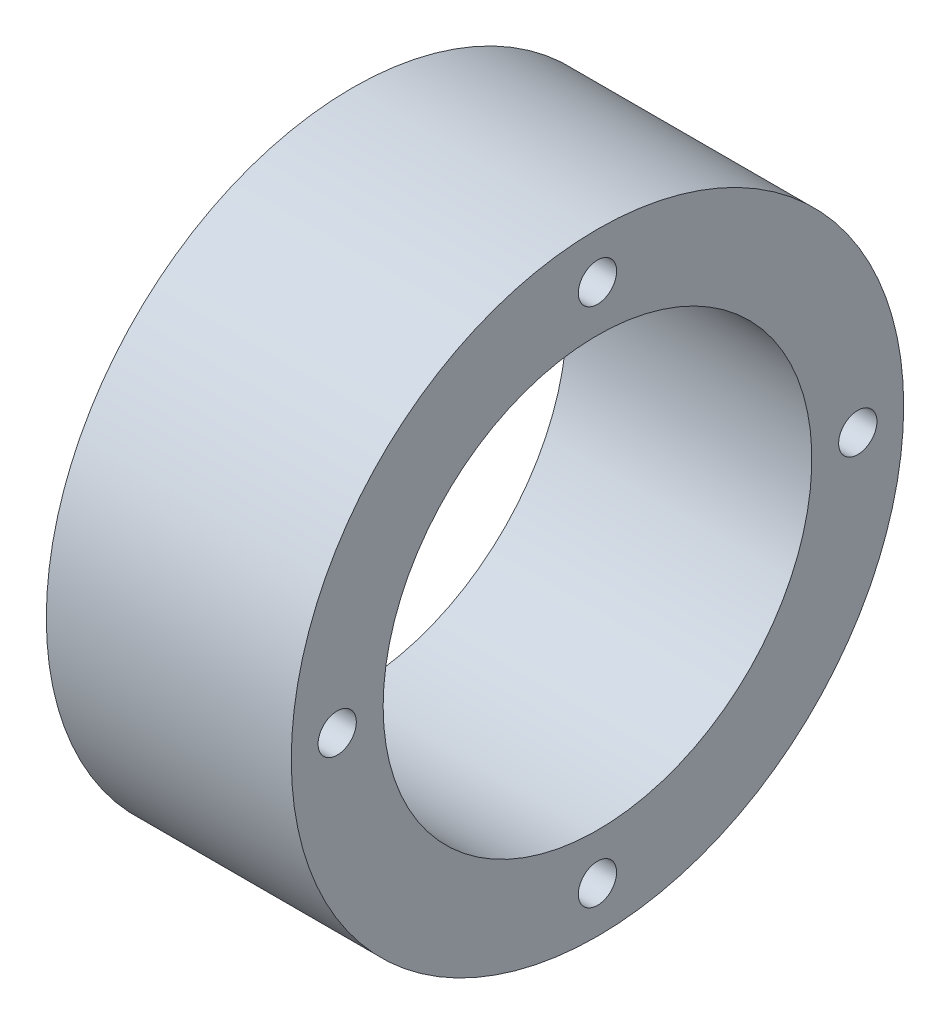
ISO-10303-21;
HEADER;
FILE_DESCRIPTION(('STEP AP214'),'2;1');
FILE_NAME('part.step','',(''),(''),'','','');
FILE_SCHEMA(('AUTOMOTIVE_DESIGN { 1 0 10303 214 1 1 1 1 }'));
ENDSEC;
DATA;
#1=APPLICATION_CONTEXT('core data for automotive mechanical design processes');
#2=APPLICATION_PROTOCOL_DEFINITION('international standard','automotive_design',2000,#1);
#3=PRODUCT_CONTEXT('',#1,'mechanical');
#4=PRODUCT('Part','Part','',(#3));
#5=PRODUCT_RELATED_PRODUCT_CATEGORY('part','',(#4));
#6=PRODUCT_DEFINITION_FORMATION('','',#4);
#7=PRODUCT_DEFINITION_CONTEXT('part definition',#1,'design');
#8=PRODUCT_DEFINITION('design','',#6,#7);
#9=PRODUCT_DEFINITION_SHAPE('','',#8);
#10=(LENGTH_UNIT() NAMED_UNIT(*) SI_UNIT(.MILLI.,.METRE.));
#11=(NAMED_UNIT(*) PLANE_ANGLE_UNIT() SI_UNIT($,.RADIAN.));
#12=(NAMED_UNIT(*) SI_UNIT($,.STERADIAN.) SOLID_ANGLE_UNIT());
#13=UNCERTAINTY_MEASURE_WITH_UNIT(LENGTH_MEASURE(1.E-05),#10,'distance_accuracy_value','');
#14=(GEOMETRIC_REPRESENTATION_CONTEXT(3) GLOBAL_UNCERTAINTY_ASSIGNED_CONTEXT((#13)) GLOBAL_UNIT_ASSIGNED_CONTEXT((#10,
#11,#12)) REPRESENTATION_CONTEXT('',''));
#15=CARTESIAN_POINT('',(0.,0.,0.));
#16=DIRECTION('',(0.,0.,1.));
#17=DIRECTION('',(1.,0.,0.));
#18=AXIS2_PLACEMENT_3D('',#15,#16,#17);
#19=CARTESIAN_POINT('',(-37.6684331780801,0.,0.));
#20=DIRECTION('',(-1.,0.,0.));
#21=DIRECTION('',(0.,0.,1.));
#22=AXIS2_PLACEMENT_3D('',#19,#20,#21);
#23=CYLINDRICAL_SURFACE('',#22,20.);
#24=CARTESIAN_POINT('',(-31.1818379069445,0.,0.));
#25=DIRECTION('',(-1.,0.,0.));
#26=DIRECTION('',(0.,0.,1.));
#27=AXIS2_PLACEMENT_3D('',#24,#25,#26);
#28=CIRCLE('',#27,20.);
#29=CARTESIAN_POINT('',(-31.1818379069445,0.,20.));
#30=VERTEX_POINT('',#29);
#31=EDGE_CURVE('E57',#30,#30,#28,.T.);
#32=ORIENTED_EDGE('',*,*,#31,.F.);
#33=EDGE_LOOP('',(#32));
#34=FACE_BOUND('',#33,.T.);
#35=CARTESIAN_POINT('',(-15.1818379069445,0.,0.));
#36=DIRECTION('',(-1.,0.,0.));
#37=DIRECTION('',(0.,0.,1.));
#38=AXIS2_PLACEMENT_3D('',#35,#36,#37);
#39=CIRCLE('',#38,20.);
#40=CARTESIAN_POINT('',(-15.1818379069445,0.,20.));
#41=VERTEX_POINT('',#40);
#42=EDGE_CURVE('E10',#41,#41,#39,.T.);
#43=ORIENTED_EDGE('',*,*,#42,.T.);
#44=EDGE_LOOP('',(#43));
#45=FACE_BOUND('',#44,.T.);
#46=ADVANCED_FACE('F43',(#34,#45),#23,.T.);
#47=CARTESIAN_POINT('',(-15.1818379069445,20.,0.));
#48=DIRECTION('',(-1.,0.,0.));
#49=DIRECTION('',(0.,0.,1.));
#50=AXIS2_PLACEMENT_3D('',#47,#48,#49);
#51=PLANE('',#50);
#52=CARTESIAN_POINT('',(-15.1818379069445,1.78065548281E-13,17.));
#53=DIRECTION('',(1.,0.,0.));
#54=DIRECTION('',(0.,0.,-1.));
#55=AXIS2_PLACEMENT_3D('',#52,#53,#54);
#56=CIRCLE('',#55,1.25);
#57=CARTESIAN_POINT('',(-15.1818379069445,1.78065548281E-13,15.75));
#58=VERTEX_POINT('',#57);
#59=EDGE_CURVE('E83',#58,#58,#56,.T.);
#60=ORIENTED_EDGE('',*,*,#59,.F.);
#61=EDGE_LOOP('',(#60));
#62=FACE_BOUND('',#61,.T.);
#63=CARTESIAN_POINT('',(-15.1818379069445,-17.,0.));
#64=DIRECTION('',(1.,0.,0.));
#65=DIRECTION('',(0.,0.,-1.));
#66=AXIS2_PLACEMENT_3D('',#63,#64,#65);
#67=CIRCLE('',#66,1.25);
#68=CARTESIAN_POINT('',(-15.1818379069445,-17.,-1.25));
#69=VERTEX_POINT('',#68);
#70=EDGE_CURVE('E77',#69,#69,#67,.T.);
#71=ORIENTED_EDGE('',*,*,#70,.F.);
#72=EDGE_LOOP('',(#71));
#73=FACE_BOUND('',#72,.T.);
#74=CARTESIAN_POINT('',(-15.1818379069445,0.,-17.));
#75=DIRECTION('',(1.,0.,0.));
#76=DIRECTION('',(0.,0.,-1.));
#77=AXIS2_PLACEMENT_3D('',#74,#75,#76);
#78=CIRCLE('',#77,1.25);
#79=CARTESIAN_POINT('',(-15.1818379069445,0.,-18.25));
#80=VERTEX_POINT('',#79);
#81=EDGE_CURVE('E71',#80,#80,#78,.T.);
#82=ORIENTED_EDGE('',*,*,#81,.F.);
#83=EDGE_LOOP('',(#82));
#84=FACE_BOUND('',#83,.T.);
#85=CARTESIAN_POINT('',(-15.1818379069445,17.,0.));
#86=DIRECTION('',(1.,0.,0.));
#87=DIRECTION('',(0.,0.,-1.));
#88=AXIS2_PLACEMENT_3D('',#85,#86,#87);
#89=CIRCLE('',#88,1.25);
#90=CARTESIAN_POINT('',(-15.1818379069445,17.,-1.25));
#91=VERTEX_POINT('',#90);
#92=EDGE_CURVE('E65',#91,#91,#89,.T.);
#93=ORIENTED_EDGE('',*,*,#92,.F.);
#94=EDGE_LOOP('',(#93));
#95=FACE_BOUND('',#94,.T.);
#96=ORIENTED_EDGE('',*,*,#42,.F.);
#97=EDGE_LOOP('',(#96));
#98=FACE_BOUND('',#97,.T.);
#99=CARTESIAN_POINT('',(-15.1818379069445,0.,0.));
#100=DIRECTION('',(-1.,0.,0.));
#101=DIRECTION('',(0.,0.,1.));
#102=AXIS2_PLACEMENT_3D('',#99,#100,#101);
#103=CIRCLE('',#102,14.);
#104=CARTESIAN_POINT('',(-15.1818379069445,0.,14.));
#105=VERTEX_POINT('',#104);
#106=EDGE_CURVE('E49',#105,#105,#103,.T.);
#107=ORIENTED_EDGE('',*,*,#106,.T.);
#108=EDGE_LOOP('',(#107));
#109=FACE_BOUND('',#108,.T.);
#110=ADVANCED_FACE('F89',(#62,#73,#84,#95,#98,#109),#51,.F.);
#111=CARTESIAN_POINT('',(-37.6684331780801,0.,0.));
#112=DIRECTION('',(-1.,0.,0.));
#113=DIRECTION('',(0.,0.,1.));
#114=AXIS2_PLACEMENT_3D('',#111,#112,#113);
#115=CYLINDRICAL_SURFACE('',#114,14.);
#116=ORIENTED_EDGE('',*,*,#106,.F.);
#117=EDGE_LOOP('',(#116));
#118=FACE_BOUND('',#117,.T.);
#119=CARTESIAN_POINT('',(-31.1818379069445,0.,0.));
#120=DIRECTION('',(-1.,0.,0.));
#121=DIRECTION('',(0.,0.,1.));
#122=AXIS2_PLACEMENT_3D('',#119,#120,#121);
#123=CIRCLE('',#122,14.);
#124=CARTESIAN_POINT('',(-31.1818379069445,0.,14.));
#125=VERTEX_POINT('',#124);
#126=EDGE_CURVE('E53',#125,#125,#123,.T.);
#127=ORIENTED_EDGE('',*,*,#126,.T.);
#128=EDGE_LOOP('',(#127));
#129=FACE_BOUND('',#128,.T.);
#130=ADVANCED_FACE('F92',(#118,#129),#115,.F.);
#131=CARTESIAN_POINT('',(-31.1818379069445,20.,0.));
#132=DIRECTION('',(1.,0.,0.));
#133=DIRECTION('',(0.,0.,-1.));
#134=AXIS2_PLACEMENT_3D('',#131,#132,#133);
#135=PLANE('',#134);
#136=CARTESIAN_POINT('',(-31.1818379069445,1.78065548281E-13,17.));
#137=DIRECTION('',(1.,0.,0.));
#138=DIRECTION('',(0.,0.,-1.));
#139=AXIS2_PLACEMENT_3D('',#136,#137,#138);
#140=CIRCLE('',#139,1.25);
#141=CARTESIAN_POINT('',(-31.1818379069445,1.78065548281E-13,15.75));
#142=VERTEX_POINT('',#141);
#143=EDGE_CURVE('E80',#142,#142,#140,.T.);
#144=ORIENTED_EDGE('',*,*,#143,.T.);
#145=EDGE_LOOP('',(#144));
#146=FACE_BOUND('',#145,.T.);
#147=CARTESIAN_POINT('',(-31.1818379069445,-17.,0.));
#148=DIRECTION('',(1.,0.,0.));
#149=DIRECTION('',(0.,0.,-1.));
#150=AXIS2_PLACEMENT_3D('',#147,#148,#149);
#151=CIRCLE('',#150,1.24999999999999);
#152=CARTESIAN_POINT('',(-31.1818379069445,-17.,-1.24999999999999));
#153=VERTEX_POINT('',#152);
#154=EDGE_CURVE('E74',#153,#153,#151,.T.);
#155=ORIENTED_EDGE('',*,*,#154,.T.);
#156=EDGE_LOOP('',(#155));
#157=FACE_BOUND('',#156,.T.);
#158=CARTESIAN_POINT('',(-31.1818379069445,0.,-17.));
#159=DIRECTION('',(1.,0.,0.));
#160=DIRECTION('',(0.,0.,-1.));
#161=AXIS2_PLACEMENT_3D('',#158,#159,#160);
#162=CIRCLE('',#161,1.25);
#163=CARTESIAN_POINT('',(-31.1818379069445,0.,-18.25));
#164=VERTEX_POINT('',#163);
#165=EDGE_CURVE('E68',#164,#164,#162,.T.);
#166=ORIENTED_EDGE('',*,*,#165,.T.);
#167=EDGE_LOOP('',(#166));
#168=FACE_BOUND('',#167,.T.);
#169=CARTESIAN_POINT('',(-31.1818379069445,17.,0.));
#170=DIRECTION('',(1.,0.,0.));
#171=DIRECTION('',(0.,0.,-1.));
#172=AXIS2_PLACEMENT_3D('',#169,#170,#171);
#173=CIRCLE('',#172,1.24999999999999);
#174=CARTESIAN_POINT('',(-31.1818379069445,17.,-1.24999999999999));
#175=VERTEX_POINT('',#174);
#176=EDGE_CURVE('E62',#175,#175,#173,.T.);
#177=ORIENTED_EDGE('',*,*,#176,.T.);
#178=EDGE_LOOP('',(#177));
#179=FACE_BOUND('',#178,.T.);
#180=ORIENTED_EDGE('',*,*,#126,.F.);
#181=EDGE_LOOP('',(#180));
#182=FACE_BOUND('',#181,.T.);
#183=ORIENTED_EDGE('',*,*,#31,.T.);
#184=EDGE_LOOP('',(#183));
#185=FACE_BOUND('',#184,.T.);
#186=ADVANCED_FACE('F103',(#146,#157,#168,#179,#182,#185),#135,.F.);
#187=CARTESIAN_POINT('',(-15.1818379069445,17.,0.));
#188=DIRECTION('',(1.,0.,0.));
#189=DIRECTION('',(0.,0.,-1.));
#190=AXIS2_PLACEMENT_3D('',#187,#188,#189);
#191=CYLINDRICAL_SURFACE('',#190,1.25);
#192=ORIENTED_EDGE('',*,*,#176,.F.);
#193=EDGE_LOOP('',(#192));
#194=FACE_BOUND('',#193,.T.);
#195=ORIENTED_EDGE('',*,*,#92,.T.);
#196=EDGE_LOOP('',(#195));
#197=FACE_BOUND('',#196,.T.);
#198=ADVANCED_FACE('F100',(#194,#197),#191,.F.);
#199=CARTESIAN_POINT('',(-15.1818379069445,0.,-17.));
#200=DIRECTION('',(1.,0.,0.));
#201=DIRECTION('',(0.,0.,-1.));
#202=AXIS2_PLACEMENT_3D('',#199,#200,#201);
#203=CYLINDRICAL_SURFACE('',#202,1.25);
#204=ORIENTED_EDGE('',*,*,#165,.F.);
#205=EDGE_LOOP('',(#204));
#206=FACE_BOUND('',#205,.T.);
#207=ORIENTED_EDGE('',*,*,#81,.T.);
#208=EDGE_LOOP('',(#207));
#209=FACE_BOUND('',#208,.T.);
#210=ADVANCED_FACE('F102',(#206,#209),#203,.F.);
#211=CARTESIAN_POINT('',(-15.1818379069445,-17.,0.));
#212=DIRECTION('',(1.,0.,0.));
#213=DIRECTION('',(0.,0.,-1.));
#214=AXIS2_PLACEMENT_3D('',#211,#212,#213);
#215=CYLINDRICAL_SURFACE('',#214,1.25);
#216=ORIENTED_EDGE('',*,*,#154,.F.);
#217=EDGE_LOOP('',(#216));
#218=FACE_BOUND('',#217,.T.);
#219=ORIENTED_EDGE('',*,*,#70,.T.);
#220=EDGE_LOOP('',(#219));
#221=FACE_BOUND('',#220,.T.);
#222=ADVANCED_FACE('F111',(#218,#221),#215,.F.);
#223=CARTESIAN_POINT('',(-15.1818379069445,1.78065548281E-13,17.));
#224=DIRECTION('',(1.,0.,0.));
#225=DIRECTION('',(0.,0.,-1.));
#226=AXIS2_PLACEMENT_3D('',#223,#224,#225);
#227=CYLINDRICAL_SURFACE('',#226,1.25);
#228=ORIENTED_EDGE('',*,*,#143,.F.);
#229=EDGE_LOOP('',(#228));
#230=FACE_BOUND('',#229,.T.);
#231=ORIENTED_EDGE('',*,*,#59,.T.);
#232=EDGE_LOOP('',(#231));
#233=FACE_BOUND('',#232,.T.);
#234=ADVANCED_FACE('F87',(#230,#233),#227,.F.);
#235=CLOSED_SHELL('',(#46,#110,#130,#186,#198,#210,#222,#234));
#236=MANIFOLD_SOLID_BREP('B2',#235);
#237=ADVANCED_BREP_SHAPE_REPRESENTATION('',(#18,#236),#14);
#238=SHAPE_DEFINITION_REPRESENTATION(#9,#237);
ENDSEC;
END-ISO-10303-21;
